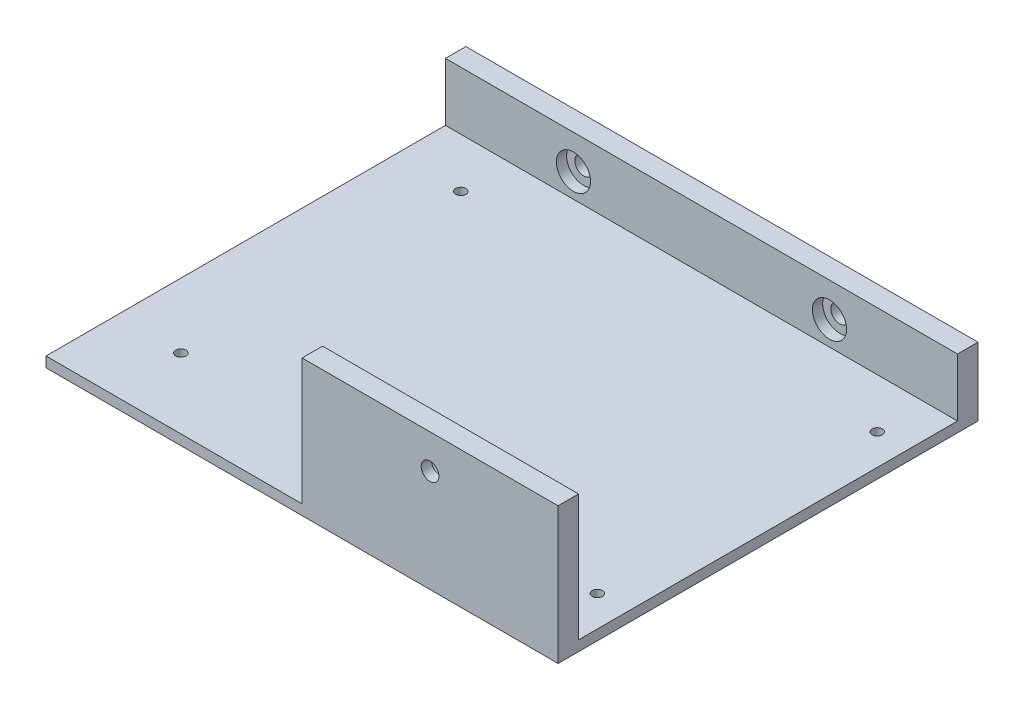
ISO-10303-21;
HEADER;
FILE_DESCRIPTION(('STEP AP214'),'2;1');
FILE_NAME('part.step','',(''),(''),'','','');
FILE_SCHEMA(('AUTOMOTIVE_DESIGN { 1 0 10303 214 1 1 1 1 }'));
ENDSEC;
DATA;
#1=APPLICATION_CONTEXT('core data for automotive mechanical design processes');
#2=APPLICATION_PROTOCOL_DEFINITION('international standard','automotive_design',2000,#1);
#3=PRODUCT_CONTEXT('',#1,'mechanical');
#4=PRODUCT('Part','Part','',(#3));
#5=PRODUCT_RELATED_PRODUCT_CATEGORY('part','',(#4));
#6=PRODUCT_DEFINITION_FORMATION('','',#4);
#7=PRODUCT_DEFINITION_CONTEXT('part definition',#1,'design');
#8=PRODUCT_DEFINITION('design','',#6,#7);
#9=PRODUCT_DEFINITION_SHAPE('','',#8);
#10=(LENGTH_UNIT() NAMED_UNIT(*) SI_UNIT(.MILLI.,.METRE.));
#11=(NAMED_UNIT(*) PLANE_ANGLE_UNIT() SI_UNIT($,.RADIAN.));
#12=(NAMED_UNIT(*) SI_UNIT($,.STERADIAN.) SOLID_ANGLE_UNIT());
#13=UNCERTAINTY_MEASURE_WITH_UNIT(LENGTH_MEASURE(1.E-05),#10,'distance_accuracy_value','');
#14=(GEOMETRIC_REPRESENTATION_CONTEXT(3) GLOBAL_UNCERTAINTY_ASSIGNED_CONTEXT((#13)) GLOBAL_UNIT_ASSIGNED_CONTEXT((#10,
#11,#12)) REPRESENTATION_CONTEXT('',''));
#15=CARTESIAN_POINT('',(0.,0.,0.));
#16=DIRECTION('',(0.,0.,1.));
#17=DIRECTION('',(1.,0.,0.));
#18=AXIS2_PLACEMENT_3D('',#15,#16,#17);
#19=CARTESIAN_POINT('',(37.5,10.,-117.));
#20=DIRECTION('',(0.,0.,-1.));
#21=DIRECTION('',(-1.,0.,0.));
#22=AXIS2_PLACEMENT_3D('',#19,#20,#21);
#23=CYLINDRICAL_SURFACE('',#22,2.6);
#24=CARTESIAN_POINT('',(37.5,10.,-123.));
#25=DIRECTION('',(0.,0.,-1.));
#26=DIRECTION('',(-1.,0.,0.));
#27=AXIS2_PLACEMENT_3D('',#24,#25,#26);
#28=CIRCLE('',#27,2.6);
#29=CARTESIAN_POINT('',(34.9,10.,-123.));
#30=VERTEX_POINT('',#29);
#31=EDGE_CURVE('E249',#30,#30,#28,.T.);
#32=ORIENTED_EDGE('',*,*,#31,.T.);
#33=EDGE_LOOP('',(#32));
#34=FACE_BOUND('',#33,.T.);
#35=CARTESIAN_POINT('',(37.5,10.,-120.));
#36=DIRECTION('',(0.,0.,1.));
#37=DIRECTION('',(1.,0.,0.));
#38=AXIS2_PLACEMENT_3D('',#35,#36,#37);
#39=CIRCLE('',#38,2.6);
#40=CARTESIAN_POINT('',(40.1,10.,-120.));
#41=VERTEX_POINT('',#40);
#42=EDGE_CURVE('E45',#41,#41,#39,.F.);
#43=ORIENTED_EDGE('',*,*,#42,.F.);
#44=EDGE_LOOP('',(#43));
#45=FACE_BOUND('',#44,.T.);
#46=ADVANCED_FACE('F41',(#34,#45),#23,.F.);
#47=CARTESIAN_POINT('',(112.5,10.,-117.));
#48=DIRECTION('',(0.,0.,-1.));
#49=DIRECTION('',(-1.,0.,0.));
#50=AXIS2_PLACEMENT_3D('',#47,#48,#49);
#51=CYLINDRICAL_SURFACE('',#50,2.6);
#52=CARTESIAN_POINT('',(112.5,10.,-123.));
#53=DIRECTION('',(0.,0.,-1.));
#54=DIRECTION('',(-1.,0.,0.));
#55=AXIS2_PLACEMENT_3D('',#52,#53,#54);
#56=CIRCLE('',#55,2.6);
#57=CARTESIAN_POINT('',(109.9,10.,-123.));
#58=VERTEX_POINT('',#57);
#59=EDGE_CURVE('E267',#58,#58,#56,.T.);
#60=ORIENTED_EDGE('',*,*,#59,.T.);
#61=EDGE_LOOP('',(#60));
#62=FACE_BOUND('',#61,.T.);
#63=CARTESIAN_POINT('',(112.5,10.,-120.));
#64=DIRECTION('',(0.,0.,1.));
#65=DIRECTION('',(1.,0.,0.));
#66=AXIS2_PLACEMENT_3D('',#63,#64,#65);
#67=CIRCLE('',#66,2.6);
#68=CARTESIAN_POINT('',(115.1,10.,-120.));
#69=VERTEX_POINT('',#68);
#70=EDGE_CURVE('E240',#69,#69,#67,.F.);
#71=ORIENTED_EDGE('',*,*,#70,.F.);
#72=EDGE_LOOP('',(#71));
#73=FACE_BOUND('',#72,.T.);
#74=ADVANCED_FACE('F312',(#62,#73),#51,.F.);
#75=CARTESIAN_POINT('',(112.5,30.,31.));
#76=DIRECTION('',(0.,0.,-1.));
#77=DIRECTION('',(-1.,0.,0.));
#78=AXIS2_PLACEMENT_3D('',#75,#76,#77);
#79=CYLINDRICAL_SURFACE('',#78,2.6);
#80=CARTESIAN_POINT('',(112.5,30.,0.));
#81=DIRECTION('',(0.,0.,-1.));
#82=DIRECTION('',(-1.,0.,0.));
#83=AXIS2_PLACEMENT_3D('',#80,#81,#82);
#84=CIRCLE('',#83,2.6);
#85=CARTESIAN_POINT('',(109.9,30.,0.));
#86=VERTEX_POINT('',#85);
#87=EDGE_CURVE('E238',#86,#86,#84,.T.);
#88=ORIENTED_EDGE('',*,*,#87,.F.);
#89=EDGE_LOOP('',(#88));
#90=FACE_BOUND('',#89,.T.);
#91=CARTESIAN_POINT('',(112.5,30.,-3.));
#92=DIRECTION('',(0.,0.,-1.));
#93=DIRECTION('',(-1.,0.,0.));
#94=AXIS2_PLACEMENT_3D('',#91,#92,#93);
#95=CIRCLE('',#94,2.6);
#96=CARTESIAN_POINT('',(109.9,30.,-3.));
#97=VERTEX_POINT('',#96);
#98=EDGE_CURVE('E235',#97,#97,#95,.F.);
#99=ORIENTED_EDGE('',*,*,#98,.F.);
#100=EDGE_LOOP('',(#99));
#101=FACE_BOUND('',#100,.T.);
#102=ADVANCED_FACE('F318',(#90,#101),#79,.F.);
#103=CARTESIAN_POINT('',(0.,3.,0.));
#104=DIRECTION('',(0.,1.,0.));
#105=DIRECTION('',(0.,0.,1.));
#106=AXIS2_PLACEMENT_3D('',#103,#104,#105);
#107=PLANE('',#106);
#108=CARTESIAN_POINT('',(141.,3.,-102.5));
#109=DIRECTION('',(0.,1.,0.));
#110=DIRECTION('',(0.,0.,1.));
#111=AXIS2_PLACEMENT_3D('',#108,#109,#110);
#112=CIRCLE('',#111,1.5);
#113=CARTESIAN_POINT('',(141.,3.,-101.));
#114=VERTEX_POINT('',#113);
#115=EDGE_CURVE('E172',#114,#114,#112,.T.);
#116=ORIENTED_EDGE('',*,*,#115,.F.);
#117=EDGE_LOOP('',(#116));
#118=FACE_BOUND('',#117,.T.);
#119=CARTESIAN_POINT('',(141.,3.,-20.5));
#120=DIRECTION('',(0.,1.,0.));
#121=DIRECTION('',(0.,0.,1.));
#122=AXIS2_PLACEMENT_3D('',#119,#120,#121);
#123=CIRCLE('',#122,1.5);
#124=CARTESIAN_POINT('',(141.,3.,-19.));
#125=VERTEX_POINT('',#124);
#126=EDGE_CURVE('E176',#125,#125,#123,.T.);
#127=ORIENTED_EDGE('',*,*,#126,.F.);
#128=EDGE_LOOP('',(#127));
#129=FACE_BOUND('',#128,.T.);
#130=CARTESIAN_POINT('',(19.,3.,-20.5));
#131=DIRECTION('',(0.,1.,0.));
#132=DIRECTION('',(0.,0.,1.));
#133=AXIS2_PLACEMENT_3D('',#130,#131,#132);
#134=CIRCLE('',#133,1.5);
#135=CARTESIAN_POINT('',(19.,3.,-19.));
#136=VERTEX_POINT('',#135);
#137=EDGE_CURVE('E181',#136,#136,#134,.T.);
#138=ORIENTED_EDGE('',*,*,#137,.F.);
#139=EDGE_LOOP('',(#138));
#140=FACE_BOUND('',#139,.T.);
#141=CARTESIAN_POINT('',(19.,3.,-102.5));
#142=DIRECTION('',(0.,1.,0.));
#143=DIRECTION('',(0.,0.,1.));
#144=AXIS2_PLACEMENT_3D('',#141,#142,#143);
#145=CIRCLE('',#144,1.5);
#146=CARTESIAN_POINT('',(19.,3.,-101.));
#147=VERTEX_POINT('',#146);
#148=EDGE_CURVE('E185',#147,#147,#145,.T.);
#149=ORIENTED_EDGE('',*,*,#148,.F.);
#150=EDGE_LOOP('',(#149));
#151=FACE_BOUND('',#150,.T.);
#152=DIRECTION('',(0.,0.,1.));
#153=VECTOR('',#152,1.);
#154=CARTESIAN_POINT('',(75.,3.,0.));
#155=LINE('',#154,#153);
#156=CARTESIAN_POINT('',(75.,3.,-5.99999999999999));
#157=VERTEX_POINT('',#156);
#158=CARTESIAN_POINT('',(75.,3.,0.));
#159=VERTEX_POINT('',#158);
#160=EDGE_CURVE('E59',#157,#159,#155,.T.);
#161=ORIENTED_EDGE('',*,*,#160,.F.);
#162=DIRECTION('',(-1.,0.,0.));
#163=VECTOR('',#162,1.);
#164=CARTESIAN_POINT('',(150.,3.,-6.));
#165=LINE('',#164,#163);
#166=CARTESIAN_POINT('',(150.,3.,-5.99999999999999));
#167=VERTEX_POINT('',#166);
#168=EDGE_CURVE('E63',#167,#157,#165,.T.);
#169=ORIENTED_EDGE('',*,*,#168,.F.);
#170=DIRECTION('',(0.,0.,-1.));
#171=VECTOR('',#170,1.);
#172=CARTESIAN_POINT('',(150.,3.,0.));
#173=LINE('',#172,#171);
#174=CARTESIAN_POINT('',(150.,3.,-117.));
#175=VERTEX_POINT('',#174);
#176=EDGE_CURVE('E137',#167,#175,#173,.T.);
#177=ORIENTED_EDGE('',*,*,#176,.T.);
#178=DIRECTION('',(1.,0.,0.));
#179=VECTOR('',#178,1.);
#180=CARTESIAN_POINT('',(0.,3.,-117.));
#181=LINE('',#180,#179);
#182=CARTESIAN_POINT('',(0.,3.,-117.));
#183=VERTEX_POINT('',#182);
#184=EDGE_CURVE('E139',#183,#175,#181,.T.);
#185=ORIENTED_EDGE('',*,*,#184,.F.);
#186=DIRECTION('',(0.,0.,-1.));
#187=VECTOR('',#186,1.);
#188=CARTESIAN_POINT('',(0.,3.,0.));
#189=LINE('',#188,#187);
#190=CARTESIAN_POINT('',(0.,3.,0.));
#191=VERTEX_POINT('',#190);
#192=EDGE_CURVE('E194',#191,#183,#189,.T.);
#193=ORIENTED_EDGE('',*,*,#192,.F.);
#194=DIRECTION('',(1.,0.,0.));
#195=VECTOR('',#194,1.);
#196=CARTESIAN_POINT('',(0.,3.,0.));
#197=LINE('',#196,#195);
#198=EDGE_CURVE('E189',#191,#159,#197,.T.);
#199=ORIENTED_EDGE('',*,*,#198,.T.);
#200=EDGE_LOOP('',(#161,#169,#177,#185,#193,#199));
#201=FACE_BOUND('',#200,.T.);
#202=ADVANCED_FACE('F333',(#118,#129,#140,#151,#201),#107,.T.);
#203=CARTESIAN_POINT('',(0.,3.,0.));
#204=DIRECTION('',(0.,0.,-1.));
#205=DIRECTION('',(-1.,0.,0.));
#206=AXIS2_PLACEMENT_3D('',#203,#204,#205);
#207=PLANE('',#206);
#208=ORIENTED_EDGE('',*,*,#87,.T.);
#209=EDGE_LOOP('',(#208));
#210=FACE_BOUND('',#209,.T.);
#211=DIRECTION('',(1.,0.,0.));
#212=VECTOR('',#211,1.);
#213=CARTESIAN_POINT('',(0.,0.,0.));
#214=LINE('',#213,#212);
#215=CARTESIAN_POINT('',(0.,0.,0.));
#216=VERTEX_POINT('',#215);
#217=CARTESIAN_POINT('',(150.,0.,0.));
#218=VERTEX_POINT('',#217);
#219=EDGE_CURVE('E214',#216,#218,#214,.T.);
#220=ORIENTED_EDGE('',*,*,#219,.T.);
#221=DIRECTION('',(0.,-1.,0.));
#222=VECTOR('',#221,1.);
#223=CARTESIAN_POINT('',(150.,3.,0.));
#224=LINE('',#223,#222);
#225=CARTESIAN_POINT('',(150.,40.,0.));
#226=VERTEX_POINT('',#225);
#227=EDGE_CURVE('E11',#226,#218,#224,.T.);
#228=ORIENTED_EDGE('',*,*,#227,.F.);
#229=DIRECTION('',(1.,0.,0.));
#230=VECTOR('',#229,1.);
#231=CARTESIAN_POINT('',(150.,40.,0.));
#232=LINE('',#231,#230);
#233=CARTESIAN_POINT('',(75.,40.,0.));
#234=VERTEX_POINT('',#233);
#235=EDGE_CURVE('E130',#234,#226,#232,.T.);
#236=ORIENTED_EDGE('',*,*,#235,.F.);
#237=DIRECTION('',(0.,-1.,0.));
#238=VECTOR('',#237,1.);
#239=CARTESIAN_POINT('',(75.,40.,0.));
#240=LINE('',#239,#238);
#241=EDGE_CURVE('E146',#234,#159,#240,.T.);
#242=ORIENTED_EDGE('',*,*,#241,.T.);
#243=ORIENTED_EDGE('',*,*,#198,.F.);
#244=DIRECTION('',(0.,-1.,0.));
#245=VECTOR('',#244,1.);
#246=CARTESIAN_POINT('',(0.,3.,0.));
#247=LINE('',#246,#245);
#248=EDGE_CURVE('E198',#191,#216,#247,.T.);
#249=ORIENTED_EDGE('',*,*,#248,.T.);
#250=EDGE_LOOP('',(#220,#228,#236,#242,#243,#249));
#251=FACE_BOUND('',#250,.T.);
#252=ADVANCED_FACE('F296',(#210,#251),#207,.F.);
#253=CARTESIAN_POINT('',(150.,3.,0.));
#254=DIRECTION('',(-1.,0.,0.));
#255=DIRECTION('',(0.,0.,1.));
#256=AXIS2_PLACEMENT_3D('',#253,#254,#255);
#257=PLANE('',#256);
#258=DIRECTION('',(0.,0.,-1.));
#259=VECTOR('',#258,1.);
#260=CARTESIAN_POINT('',(150.,0.,0.));
#261=LINE('',#260,#259);
#262=CARTESIAN_POINT('',(150.,0.,-123.));
#263=VERTEX_POINT('',#262);
#264=EDGE_CURVE('E218',#218,#263,#261,.T.);
#265=ORIENTED_EDGE('',*,*,#264,.T.);
#266=DIRECTION('',(0.,-1.,0.));
#267=VECTOR('',#266,1.);
#268=CARTESIAN_POINT('',(150.,3.,-123.));
#269=LINE('',#268,#267);
#270=CARTESIAN_POINT('',(150.,20.,-123.));
#271=VERTEX_POINT('',#270);
#272=EDGE_CURVE('E51',#271,#263,#269,.T.);
#273=ORIENTED_EDGE('',*,*,#272,.F.);
#274=DIRECTION('',(0.,0.,-1.));
#275=VECTOR('',#274,1.);
#276=CARTESIAN_POINT('',(150.,20.,-123.));
#277=LINE('',#276,#275);
#278=CARTESIAN_POINT('',(150.,20.,-117.));
#279=VERTEX_POINT('',#278);
#280=EDGE_CURVE('E156',#279,#271,#277,.T.);
#281=ORIENTED_EDGE('',*,*,#280,.F.);
#282=DIRECTION('',(0.,-1.,0.));
#283=VECTOR('',#282,1.);
#284=CARTESIAN_POINT('',(150.,20.,-117.));
#285=LINE('',#284,#283);
#286=EDGE_CURVE('E163',#279,#175,#285,.T.);
#287=ORIENTED_EDGE('',*,*,#286,.T.);
#288=ORIENTED_EDGE('',*,*,#176,.F.);
#289=DIRECTION('',(0.,-1.,0.));
#290=VECTOR('',#289,1.);
#291=CARTESIAN_POINT('',(150.,40.,-6.));
#292=LINE('',#291,#290);
#293=CARTESIAN_POINT('',(150.,40.,-6.));
#294=VERTEX_POINT('',#293);
#295=EDGE_CURVE('E117',#294,#167,#292,.T.);
#296=ORIENTED_EDGE('',*,*,#295,.F.);
#297=DIRECTION('',(0.,0.,-1.));
#298=VECTOR('',#297,1.);
#299=CARTESIAN_POINT('',(150.,40.,0.));
#300=LINE('',#299,#298);
#301=EDGE_CURVE('E124',#226,#294,#300,.T.);
#302=ORIENTED_EDGE('',*,*,#301,.F.);
#303=ORIENTED_EDGE('',*,*,#227,.T.);
#304=EDGE_LOOP('',(#265,#273,#281,#287,#288,#296,#302,#303));
#305=FACE_BOUND('',#304,.T.);
#306=ADVANCED_FACE('F135',(#305),#257,.F.);
#307=CARTESIAN_POINT('',(0.,3.,-123.));
#308=DIRECTION('',(0.,0.,-1.));
#309=DIRECTION('',(-1.,0.,0.));
#310=AXIS2_PLACEMENT_3D('',#307,#308,#309);
#311=PLANE('',#310);
#312=ORIENTED_EDGE('',*,*,#59,.F.);
#313=EDGE_LOOP('',(#312));
#314=FACE_BOUND('',#313,.T.);
#315=ORIENTED_EDGE('',*,*,#31,.F.);
#316=EDGE_LOOP('',(#315));
#317=FACE_BOUND('',#316,.T.);
#318=DIRECTION('',(1.,0.,0.));
#319=VECTOR('',#318,1.);
#320=CARTESIAN_POINT('',(0.,0.,-123.));
#321=LINE('',#320,#319);
#322=CARTESIAN_POINT('',(0.,0.,-123.));
#323=VERTEX_POINT('',#322);
#324=EDGE_CURVE('E221',#323,#263,#321,.T.);
#325=ORIENTED_EDGE('',*,*,#324,.F.);
#326=DIRECTION('',(0.,-1.,0.));
#327=VECTOR('',#326,1.);
#328=CARTESIAN_POINT('',(0.,3.,-123.));
#329=LINE('',#328,#327);
#330=CARTESIAN_POINT('',(0.,20.,-123.));
#331=VERTEX_POINT('',#330);
#332=EDGE_CURVE('E230',#331,#323,#329,.T.);
#333=ORIENTED_EDGE('',*,*,#332,.F.);
#334=DIRECTION('',(-1.,0.,0.));
#335=VECTOR('',#334,1.);
#336=CARTESIAN_POINT('',(0.,20.,-123.));
#337=LINE('',#336,#335);
#338=EDGE_CURVE('E160',#271,#331,#337,.T.);
#339=ORIENTED_EDGE('',*,*,#338,.F.);
#340=ORIENTED_EDGE('',*,*,#272,.T.);
#341=EDGE_LOOP('',(#325,#333,#339,#340));
#342=FACE_BOUND('',#341,.T.);
#343=ADVANCED_FACE('F350',(#314,#317,#342),#311,.T.);
#344=CARTESIAN_POINT('',(19.,3.,-102.5));
#345=DIRECTION('',(0.,-1.,0.));
#346=DIRECTION('',(0.,0.,-1.));
#347=AXIS2_PLACEMENT_3D('',#344,#345,#346);
#348=CYLINDRICAL_SURFACE('',#347,1.5);
#349=ORIENTED_EDGE('',*,*,#148,.T.);
#350=EDGE_LOOP('',(#349));
#351=FACE_BOUND('',#350,.T.);
#352=CARTESIAN_POINT('',(19.,0.,-102.5));
#353=DIRECTION('',(0.,1.,0.));
#354=DIRECTION('',(0.,0.,1.));
#355=AXIS2_PLACEMENT_3D('',#352,#353,#354);
#356=CIRCLE('',#355,1.5);
#357=CARTESIAN_POINT('',(19.,0.,-101.));
#358=VERTEX_POINT('',#357);
#359=EDGE_CURVE('E210',#358,#358,#356,.T.);
#360=ORIENTED_EDGE('',*,*,#359,.F.);
#361=EDGE_LOOP('',(#360));
#362=FACE_BOUND('',#361,.T.);
#363=ADVANCED_FACE('F354',(#351,#362),#348,.F.);
#364=CARTESIAN_POINT('',(19.,3.,-20.5));
#365=DIRECTION('',(0.,-1.,0.));
#366=DIRECTION('',(0.,0.,-1.));
#367=AXIS2_PLACEMENT_3D('',#364,#365,#366);
#368=CYLINDRICAL_SURFACE('',#367,1.5);
#369=ORIENTED_EDGE('',*,*,#137,.T.);
#370=EDGE_LOOP('',(#369));
#371=FACE_BOUND('',#370,.T.);
#372=CARTESIAN_POINT('',(19.,0.,-20.5));
#373=DIRECTION('',(0.,1.,0.));
#374=DIRECTION('',(0.,0.,1.));
#375=AXIS2_PLACEMENT_3D('',#372,#373,#374);
#376=CIRCLE('',#375,1.5);
#377=CARTESIAN_POINT('',(19.,0.,-19.));
#378=VERTEX_POINT('',#377);
#379=EDGE_CURVE('E206',#378,#378,#376,.T.);
#380=ORIENTED_EDGE('',*,*,#379,.F.);
#381=EDGE_LOOP('',(#380));
#382=FACE_BOUND('',#381,.T.);
#383=ADVANCED_FACE('F357',(#371,#382),#368,.F.);
#384=CARTESIAN_POINT('',(141.,3.,-20.5));
#385=DIRECTION('',(0.,-1.,0.));
#386=DIRECTION('',(0.,0.,-1.));
#387=AXIS2_PLACEMENT_3D('',#384,#385,#386);
#388=CYLINDRICAL_SURFACE('',#387,1.5);
#389=ORIENTED_EDGE('',*,*,#126,.T.);
#390=EDGE_LOOP('',(#389));
#391=FACE_BOUND('',#390,.T.);
#392=CARTESIAN_POINT('',(141.,0.,-20.5));
#393=DIRECTION('',(0.,1.,0.));
#394=DIRECTION('',(0.,0.,1.));
#395=AXIS2_PLACEMENT_3D('',#392,#393,#394);
#396=CIRCLE('',#395,1.5);
#397=CARTESIAN_POINT('',(141.,0.,-19.));
#398=VERTEX_POINT('',#397);
#399=EDGE_CURVE('E202',#398,#398,#396,.T.);
#400=ORIENTED_EDGE('',*,*,#399,.F.);
#401=EDGE_LOOP('',(#400));
#402=FACE_BOUND('',#401,.T.);
#403=ADVANCED_FACE('F360',(#391,#402),#388,.F.);
#404=CARTESIAN_POINT('',(141.,3.,-102.5));
#405=DIRECTION('',(0.,-1.,0.));
#406=DIRECTION('',(0.,0.,-1.));
#407=AXIS2_PLACEMENT_3D('',#404,#405,#406);
#408=CYLINDRICAL_SURFACE('',#407,1.5);
#409=ORIENTED_EDGE('',*,*,#115,.T.);
#410=EDGE_LOOP('',(#409));
#411=FACE_BOUND('',#410,.T.);
#412=CARTESIAN_POINT('',(141.,0.,-102.5));
#413=DIRECTION('',(0.,1.,0.));
#414=DIRECTION('',(0.,0.,1.));
#415=AXIS2_PLACEMENT_3D('',#412,#413,#414);
#416=CIRCLE('',#415,1.5);
#417=CARTESIAN_POINT('',(141.,0.,-101.));
#418=VERTEX_POINT('',#417);
#419=EDGE_CURVE('E171',#418,#418,#416,.T.);
#420=ORIENTED_EDGE('',*,*,#419,.F.);
#421=EDGE_LOOP('',(#420));
#422=FACE_BOUND('',#421,.T.);
#423=ADVANCED_FACE('F43',(#411,#422),#408,.F.);
#424=CARTESIAN_POINT('',(0.,3.,0.));
#425=DIRECTION('',(-1.,0.,0.));
#426=DIRECTION('',(0.,0.,1.));
#427=AXIS2_PLACEMENT_3D('',#424,#425,#426);
#428=PLANE('',#427);
#429=DIRECTION('',(0.,0.,-1.));
#430=VECTOR('',#429,1.);
#431=CARTESIAN_POINT('',(0.,0.,0.));
#432=LINE('',#431,#430);
#433=EDGE_CURVE('E177',#216,#323,#432,.T.);
#434=ORIENTED_EDGE('',*,*,#433,.F.);
#435=ORIENTED_EDGE('',*,*,#248,.F.);
#436=ORIENTED_EDGE('',*,*,#192,.T.);
#437=DIRECTION('',(0.,-1.,0.));
#438=VECTOR('',#437,1.);
#439=CARTESIAN_POINT('',(0.,20.,-117.));
#440=LINE('',#439,#438);
#441=CARTESIAN_POINT('',(0.,20.,-117.));
#442=VERTEX_POINT('',#441);
#443=EDGE_CURVE('E167',#442,#183,#440,.T.);
#444=ORIENTED_EDGE('',*,*,#443,.F.);
#445=DIRECTION('',(0.,0.,1.));
#446=VECTOR('',#445,1.);
#447=CARTESIAN_POINT('',(0.,20.,-123.));
#448=LINE('',#447,#446);
#449=EDGE_CURVE('E144',#331,#442,#448,.T.);
#450=ORIENTED_EDGE('',*,*,#449,.F.);
#451=ORIENTED_EDGE('',*,*,#332,.T.);
#452=EDGE_LOOP('',(#434,#435,#436,#444,#450,#451));
#453=FACE_BOUND('',#452,.T.);
#454=ADVANCED_FACE('F367',(#453),#428,.T.);
#455=CARTESIAN_POINT('',(0.,0.,0.));
#456=DIRECTION('',(0.,1.,0.));
#457=DIRECTION('',(0.,0.,1.));
#458=AXIS2_PLACEMENT_3D('',#455,#456,#457);
#459=PLANE('',#458);
#460=ORIENTED_EDGE('',*,*,#419,.T.);
#461=EDGE_LOOP('',(#460));
#462=FACE_BOUND('',#461,.T.);
#463=ORIENTED_EDGE('',*,*,#399,.T.);
#464=EDGE_LOOP('',(#463));
#465=FACE_BOUND('',#464,.T.);
#466=ORIENTED_EDGE('',*,*,#379,.T.);
#467=EDGE_LOOP('',(#466));
#468=FACE_BOUND('',#467,.T.);
#469=ORIENTED_EDGE('',*,*,#359,.T.);
#470=EDGE_LOOP('',(#469));
#471=FACE_BOUND('',#470,.T.);
#472=ORIENTED_EDGE('',*,*,#219,.F.);
#473=ORIENTED_EDGE('',*,*,#433,.T.);
#474=ORIENTED_EDGE('',*,*,#324,.T.);
#475=ORIENTED_EDGE('',*,*,#264,.F.);
#476=EDGE_LOOP('',(#472,#473,#474,#475));
#477=FACE_BOUND('',#476,.T.);
#478=ADVANCED_FACE('F373',(#462,#465,#468,#471,#477),#459,.F.);
#479=CARTESIAN_POINT('',(0.,20.,-117.));
#480=DIRECTION('',(0.,0.,-1.));
#481=DIRECTION('',(-1.,0.,0.));
#482=AXIS2_PLACEMENT_3D('',#479,#480,#481);
#483=PLANE('',#482);
#484=CARTESIAN_POINT('',(37.5,10.,-117.));
#485=DIRECTION('',(0.,0.,1.));
#486=DIRECTION('',(1.,0.,0.));
#487=AXIS2_PLACEMENT_3D('',#484,#485,#486);
#488=CIRCLE('',#487,5.);
#489=CARTESIAN_POINT('',(42.5,10.,-117.));
#490=VERTEX_POINT('',#489);
#491=EDGE_CURVE('E251',#490,#490,#488,.T.);
#492=ORIENTED_EDGE('',*,*,#491,.F.);
#493=EDGE_LOOP('',(#492));
#494=FACE_BOUND('',#493,.T.);
#495=CARTESIAN_POINT('',(112.5,10.,-117.));
#496=DIRECTION('',(0.,0.,1.));
#497=DIRECTION('',(1.,0.,0.));
#498=AXIS2_PLACEMENT_3D('',#495,#496,#497);
#499=CIRCLE('',#498,5.);
#500=CARTESIAN_POINT('',(117.5,10.,-117.));
#501=VERTEX_POINT('',#500);
#502=EDGE_CURVE('E263',#501,#501,#499,.T.);
#503=ORIENTED_EDGE('',*,*,#502,.F.);
#504=EDGE_LOOP('',(#503));
#505=FACE_BOUND('',#504,.T.);
#506=ORIENTED_EDGE('',*,*,#184,.T.);
#507=ORIENTED_EDGE('',*,*,#286,.F.);
#508=DIRECTION('',(1.,0.,0.));
#509=VECTOR('',#508,1.);
#510=CARTESIAN_POINT('',(0.,20.,-117.));
#511=LINE('',#510,#509);
#512=EDGE_CURVE('E153',#442,#279,#511,.T.);
#513=ORIENTED_EDGE('',*,*,#512,.F.);
#514=ORIENTED_EDGE('',*,*,#443,.T.);
#515=EDGE_LOOP('',(#506,#507,#513,#514));
#516=FACE_BOUND('',#515,.T.);
#517=ADVANCED_FACE('F376',(#494,#505,#516),#483,.F.);
#518=CARTESIAN_POINT('',(0.,20.,0.));
#519=DIRECTION('',(0.,1.,0.));
#520=DIRECTION('',(0.,0.,1.));
#521=AXIS2_PLACEMENT_3D('',#518,#519,#520);
#522=PLANE('',#521);
#523=ORIENTED_EDGE('',*,*,#449,.T.);
#524=ORIENTED_EDGE('',*,*,#512,.T.);
#525=ORIENTED_EDGE('',*,*,#280,.T.);
#526=ORIENTED_EDGE('',*,*,#338,.T.);
#527=EDGE_LOOP('',(#523,#524,#525,#526));
#528=FACE_BOUND('',#527,.T.);
#529=ADVANCED_FACE('F308',(#528),#522,.T.);
#530=CARTESIAN_POINT('',(150.,40.,-6.));
#531=DIRECTION('',(0.,0.,1.));
#532=DIRECTION('',(1.,0.,0.));
#533=AXIS2_PLACEMENT_3D('',#530,#531,#532);
#534=PLANE('',#533);
#535=CARTESIAN_POINT('',(112.5,30.,-6.));
#536=DIRECTION('',(0.,0.,-1.));
#537=DIRECTION('',(-1.,0.,0.));
#538=AXIS2_PLACEMENT_3D('',#535,#536,#537);
#539=CIRCLE('',#538,5.00000000000001);
#540=CARTESIAN_POINT('',(107.5,30.,-5.99999999999999));
#541=VERTEX_POINT('',#540);
#542=EDGE_CURVE('E271',#541,#541,#539,.T.);
#543=ORIENTED_EDGE('',*,*,#542,.F.);
#544=EDGE_LOOP('',(#543));
#545=FACE_BOUND('',#544,.T.);
#546=ORIENTED_EDGE('',*,*,#168,.T.);
#547=DIRECTION('',(0.,-1.,0.));
#548=VECTOR('',#547,1.);
#549=CARTESIAN_POINT('',(75.,40.,-5.99999999999999));
#550=LINE('',#549,#548);
#551=CARTESIAN_POINT('',(75.,40.,-5.99999999999999));
#552=VERTEX_POINT('',#551);
#553=EDGE_CURVE('E119',#552,#157,#550,.T.);
#554=ORIENTED_EDGE('',*,*,#553,.F.);
#555=DIRECTION('',(-1.,0.,0.));
#556=VECTOR('',#555,1.);
#557=CARTESIAN_POINT('',(150.,40.,-6.));
#558=LINE('',#557,#556);
#559=EDGE_CURVE('E113',#294,#552,#558,.T.);
#560=ORIENTED_EDGE('',*,*,#559,.F.);
#561=ORIENTED_EDGE('',*,*,#295,.T.);
#562=EDGE_LOOP('',(#546,#554,#560,#561));
#563=FACE_BOUND('',#562,.T.);
#564=ADVANCED_FACE('F115',(#545,#563),#534,.F.);
#565=CARTESIAN_POINT('',(75.,40.,0.));
#566=DIRECTION('',(1.,0.,0.));
#567=DIRECTION('',(0.,0.,-1.));
#568=AXIS2_PLACEMENT_3D('',#565,#566,#567);
#569=PLANE('',#568);
#570=ORIENTED_EDGE('',*,*,#160,.T.);
#571=ORIENTED_EDGE('',*,*,#241,.F.);
#572=DIRECTION('',(0.,0.,1.));
#573=VECTOR('',#572,1.);
#574=CARTESIAN_POINT('',(75.,40.,0.));
#575=LINE('',#574,#573);
#576=EDGE_CURVE('E123',#552,#234,#575,.T.);
#577=ORIENTED_EDGE('',*,*,#576,.F.);
#578=ORIENTED_EDGE('',*,*,#553,.T.);
#579=EDGE_LOOP('',(#570,#571,#577,#578));
#580=FACE_BOUND('',#579,.T.);
#581=ADVANCED_FACE('F299',(#580),#569,.F.);
#582=CARTESIAN_POINT('',(0.,40.,0.));
#583=DIRECTION('',(0.,1.,0.));
#584=DIRECTION('',(0.,0.,1.));
#585=AXIS2_PLACEMENT_3D('',#582,#583,#584);
#586=PLANE('',#585);
#587=ORIENTED_EDGE('',*,*,#301,.T.);
#588=ORIENTED_EDGE('',*,*,#559,.T.);
#589=ORIENTED_EDGE('',*,*,#576,.T.);
#590=ORIENTED_EDGE('',*,*,#235,.T.);
#591=EDGE_LOOP('',(#587,#588,#589,#590));
#592=FACE_BOUND('',#591,.T.);
#593=ADVANCED_FACE('F128',(#592),#586,.T.);
#594=CARTESIAN_POINT('',(112.5,30.,-3.));
#595=DIRECTION('',(0.,0.,-1.));
#596=DIRECTION('',(-1.,0.,0.));
#597=AXIS2_PLACEMENT_3D('',#594,#595,#596);
#598=PLANE('',#597);
#599=CARTESIAN_POINT('',(112.5,30.,-3.));
#600=DIRECTION('',(0.,0.,-1.));
#601=DIRECTION('',(-1.,0.,0.));
#602=AXIS2_PLACEMENT_3D('',#599,#600,#601);
#603=CIRCLE('',#602,5.00000000000001);
#604=CARTESIAN_POINT('',(107.5,30.,-3.));
#605=VERTEX_POINT('',#604);
#606=EDGE_CURVE('E239',#605,#605,#603,.T.);
#607=ORIENTED_EDGE('',*,*,#606,.T.);
#608=EDGE_LOOP('',(#607));
#609=FACE_BOUND('',#608,.T.);
#610=ORIENTED_EDGE('',*,*,#98,.T.);
#611=EDGE_LOOP('',(#610));
#612=FACE_BOUND('',#611,.T.);
#613=ADVANCED_FACE('F306',(#609,#612),#598,.T.);
#614=CARTESIAN_POINT('',(112.5,30.,-3.));
#615=DIRECTION('',(0.,0.,-1.));
#616=DIRECTION('',(-1.,0.,0.));
#617=AXIS2_PLACEMENT_3D('',#614,#615,#616);
#618=CYLINDRICAL_SURFACE('',#617,5.00000000000001);
#619=ORIENTED_EDGE('',*,*,#606,.F.);
#620=EDGE_LOOP('',(#619));
#621=FACE_BOUND('',#620,.T.);
#622=ORIENTED_EDGE('',*,*,#542,.T.);
#623=EDGE_LOOP('',(#622));
#624=FACE_BOUND('',#623,.T.);
#625=ADVANCED_FACE('F326',(#621,#624),#618,.F.);
#626=CARTESIAN_POINT('',(112.5,10.,-120.));
#627=DIRECTION('',(0.,0.,1.));
#628=DIRECTION('',(1.,0.,0.));
#629=AXIS2_PLACEMENT_3D('',#626,#627,#628);
#630=PLANE('',#629);
#631=CARTESIAN_POINT('',(112.5,10.,-120.));
#632=DIRECTION('',(0.,0.,1.));
#633=DIRECTION('',(1.,0.,0.));
#634=AXIS2_PLACEMENT_3D('',#631,#632,#633);
#635=CIRCLE('',#634,5.);
#636=CARTESIAN_POINT('',(117.5,10.,-120.));
#637=VERTEX_POINT('',#636);
#638=EDGE_CURVE('E257',#637,#637,#635,.T.);
#639=ORIENTED_EDGE('',*,*,#638,.T.);
#640=EDGE_LOOP('',(#639));
#641=FACE_BOUND('',#640,.T.);
#642=ORIENTED_EDGE('',*,*,#70,.T.);
#643=EDGE_LOOP('',(#642));
#644=FACE_BOUND('',#643,.T.);
#645=ADVANCED_FACE('F330',(#641,#644),#630,.T.);
#646=CARTESIAN_POINT('',(112.5,10.,-120.));
#647=DIRECTION('',(0.,0.,1.));
#648=DIRECTION('',(1.,0.,0.));
#649=AXIS2_PLACEMENT_3D('',#646,#647,#648);
#650=CYLINDRICAL_SURFACE('',#649,5.);
#651=ORIENTED_EDGE('',*,*,#638,.F.);
#652=EDGE_LOOP('',(#651));
#653=FACE_BOUND('',#652,.T.);
#654=ORIENTED_EDGE('',*,*,#502,.T.);
#655=EDGE_LOOP('',(#654));
#656=FACE_BOUND('',#655,.T.);
#657=ADVANCED_FACE('F511',(#653,#656),#650,.F.);
#658=CARTESIAN_POINT('',(37.5,10.,-120.));
#659=DIRECTION('',(0.,0.,1.));
#660=DIRECTION('',(1.,0.,0.));
#661=AXIS2_PLACEMENT_3D('',#658,#659,#660);
#662=PLANE('',#661);
#663=CARTESIAN_POINT('',(37.5,10.,-120.));
#664=DIRECTION('',(0.,0.,1.));
#665=DIRECTION('',(1.,0.,0.));
#666=AXIS2_PLACEMENT_3D('',#663,#664,#665);
#667=CIRCLE('',#666,5.);
#668=CARTESIAN_POINT('',(42.5,10.,-120.));
#669=VERTEX_POINT('',#668);
#670=EDGE_CURVE('E243',#669,#669,#667,.T.);
#671=ORIENTED_EDGE('',*,*,#670,.T.);
#672=EDGE_LOOP('',(#671));
#673=FACE_BOUND('',#672,.T.);
#674=ORIENTED_EDGE('',*,*,#42,.T.);
#675=EDGE_LOOP('',(#674));
#676=FACE_BOUND('',#675,.T.);
#677=ADVANCED_FACE('F519',(#673,#676),#662,.T.);
#678=CARTESIAN_POINT('',(37.5,10.,-120.));
#679=DIRECTION('',(0.,0.,1.));
#680=DIRECTION('',(1.,0.,0.));
#681=AXIS2_PLACEMENT_3D('',#678,#679,#680);
#682=CYLINDRICAL_SURFACE('',#681,5.);
#683=ORIENTED_EDGE('',*,*,#670,.F.);
#684=EDGE_LOOP('',(#683));
#685=FACE_BOUND('',#684,.T.);
#686=ORIENTED_EDGE('',*,*,#491,.T.);
#687=EDGE_LOOP('',(#686));
#688=FACE_BOUND('',#687,.T.);
#689=ADVANCED_FACE('F526',(#685,#688),#682,.F.);
#690=CLOSED_SHELL('',(#46,#74,#102,#202,#252,#306,#343,#363,#383,#403,#423,#454,#478,#517,#529,
#564,#581,#593,#613,#625,#645,#657,#677,#689));
#691=MANIFOLD_SOLID_BREP('B2',#690);
#692=ADVANCED_BREP_SHAPE_REPRESENTATION('',(#18,#691),#14);
#693=SHAPE_DEFINITION_REPRESENTATION(#9,#692);
ENDSEC;
END-ISO-10303-21;
